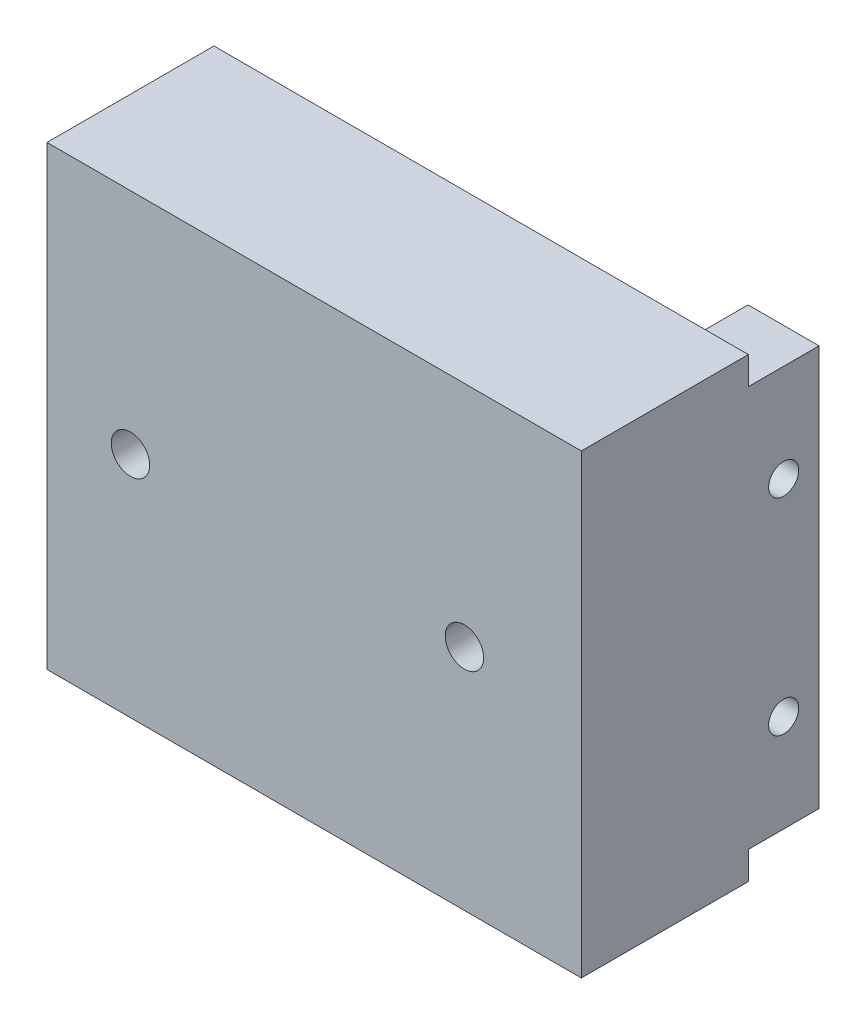
ISO-10303-21;
HEADER;
FILE_DESCRIPTION(('STEP AP214'),'2;1');
FILE_NAME('part.step','',(''),(''),'','','');
FILE_SCHEMA(('AUTOMOTIVE_DESIGN { 1 0 10303 214 1 1 1 1 }'));
ENDSEC;
DATA;
#1=APPLICATION_CONTEXT('core data for automotive mechanical design processes');
#2=APPLICATION_PROTOCOL_DEFINITION('international standard','automotive_design',2000,#1);
#3=PRODUCT_CONTEXT('',#1,'mechanical');
#4=PRODUCT('Part','Part','',(#3));
#5=PRODUCT_RELATED_PRODUCT_CATEGORY('part','',(#4));
#6=PRODUCT_DEFINITION_FORMATION('','',#4);
#7=PRODUCT_DEFINITION_CONTEXT('part definition',#1,'design');
#8=PRODUCT_DEFINITION('design','',#6,#7);
#9=PRODUCT_DEFINITION_SHAPE('','',#8);
#10=(LENGTH_UNIT() NAMED_UNIT(*) SI_UNIT(.MILLI.,.METRE.));
#11=(NAMED_UNIT(*) PLANE_ANGLE_UNIT() SI_UNIT($,.RADIAN.));
#12=(NAMED_UNIT(*) SI_UNIT($,.STERADIAN.) SOLID_ANGLE_UNIT());
#13=UNCERTAINTY_MEASURE_WITH_UNIT(LENGTH_MEASURE(1.E-05),#10,'distance_accuracy_value','');
#14=(GEOMETRIC_REPRESENTATION_CONTEXT(3) GLOBAL_UNCERTAINTY_ASSIGNED_CONTEXT((#13)) GLOBAL_UNIT_ASSIGNED_CONTEXT((#10,
#11,#12)) REPRESENTATION_CONTEXT('',''));
#15=CARTESIAN_POINT('',(0.,0.,0.));
#16=DIRECTION('',(0.,0.,1.));
#17=DIRECTION('',(1.,0.,0.));
#18=AXIS2_PLACEMENT_3D('',#15,#16,#17);
#19=CARTESIAN_POINT('',(-22.5,-20.5,15.));
#20=DIRECTION('',(0.,1.,0.));
#21=DIRECTION('',(0.,0.,1.));
#22=AXIS2_PLACEMENT_3D('',#19,#20,#21);
#23=PLANE('',#22);
#24=DIRECTION('',(1.,0.,0.));
#25=VECTOR('',#24,1.);
#26=CARTESIAN_POINT('',(-22.5,-20.5,0.));
#27=LINE('',#26,#25);
#28=CARTESIAN_POINT('',(-22.5,-20.5,0.));
#29=VERTEX_POINT('',#28);
#30=CARTESIAN_POINT('',(25.5,-20.5,0.));
#31=VERTEX_POINT('',#30);
#32=EDGE_CURVE('E158',#29,#31,#27,.T.);
#33=ORIENTED_EDGE('',*,*,#32,.T.);
#34=DIRECTION('',(0.,0.,-1.));
#35=VECTOR('',#34,1.);
#36=CARTESIAN_POINT('',(25.5,-20.5,15.));
#37=LINE('',#36,#35);
#38=CARTESIAN_POINT('',(25.5,-20.5,15.));
#39=VERTEX_POINT('',#38);
#40=EDGE_CURVE('E11',#39,#31,#37,.T.);
#41=ORIENTED_EDGE('',*,*,#40,.F.);
#42=DIRECTION('',(1.,0.,0.));
#43=VECTOR('',#42,1.);
#44=CARTESIAN_POINT('',(-22.5,-20.5,15.));
#45=LINE('',#44,#43);
#46=CARTESIAN_POINT('',(-22.5,-20.5,15.));
#47=VERTEX_POINT('',#46);
#48=EDGE_CURVE('E162',#47,#39,#45,.T.);
#49=ORIENTED_EDGE('',*,*,#48,.F.);
#50=DIRECTION('',(0.,0.,-1.));
#51=VECTOR('',#50,1.);
#52=CARTESIAN_POINT('',(-22.5,-20.5,15.));
#53=LINE('',#52,#51);
#54=EDGE_CURVE('E63',#47,#29,#53,.T.);
#55=ORIENTED_EDGE('',*,*,#54,.T.);
#56=EDGE_LOOP('',(#33,#41,#49,#55));
#57=FACE_BOUND('',#56,.T.);
#58=ADVANCED_FACE('F38',(#57),#23,.F.);
#59=CARTESIAN_POINT('',(25.5,-20.5,15.));
#60=DIRECTION('',(-1.,0.,0.));
#61=DIRECTION('',(0.,0.,1.));
#62=AXIS2_PLACEMENT_3D('',#59,#60,#61);
#63=PLANE('',#62);
#64=CARTESIAN_POINT('',(25.5,9.25,-3.175));
#65=DIRECTION('',(1.,0.,0.));
#66=DIRECTION('',(0.,0.,-1.));
#67=AXIS2_PLACEMENT_3D('',#64,#65,#66);
#68=CIRCLE('',#67,1.35255);
#69=CARTESIAN_POINT('',(25.5,9.25,-4.52755));
#70=VERTEX_POINT('',#69);
#71=EDGE_CURVE('E244',#70,#70,#68,.T.);
#72=ORIENTED_EDGE('',*,*,#71,.F.);
#73=EDGE_LOOP('',(#72));
#74=FACE_BOUND('',#73,.T.);
#75=CARTESIAN_POINT('',(25.5,-9.25000000000002,-3.175));
#76=DIRECTION('',(1.,0.,0.));
#77=DIRECTION('',(0.,0.,-1.));
#78=AXIS2_PLACEMENT_3D('',#75,#76,#77);
#79=CIRCLE('',#78,1.35255);
#80=CARTESIAN_POINT('',(25.5,-9.25000000000002,-4.52755));
#81=VERTEX_POINT('',#80);
#82=EDGE_CURVE('E247',#81,#81,#79,.T.);
#83=ORIENTED_EDGE('',*,*,#82,.F.);
#84=EDGE_LOOP('',(#83));
#85=FACE_BOUND('',#84,.T.);
#86=DIRECTION('',(0.,1.,0.));
#87=VECTOR('',#86,1.);
#88=CARTESIAN_POINT('',(25.5,-20.5,0.));
#89=LINE('',#88,#87);
#90=CARTESIAN_POINT('',(25.5,-18.,0.));
#91=VERTEX_POINT('',#90);
#92=EDGE_CURVE('E180',#31,#91,#89,.T.);
#93=ORIENTED_EDGE('',*,*,#92,.T.);
#94=DIRECTION('',(0.,0.,1.));
#95=VECTOR('',#94,1.);
#96=CARTESIAN_POINT('',(25.5,-18.,-6.35));
#97=LINE('',#96,#95);
#98=CARTESIAN_POINT('',(25.5,-18.,-6.35));
#99=VERTEX_POINT('',#98);
#100=EDGE_CURVE('E150',#99,#91,#97,.T.);
#101=ORIENTED_EDGE('',*,*,#100,.F.);
#102=DIRECTION('',(0.,1.,0.));
#103=VECTOR('',#102,1.);
#104=CARTESIAN_POINT('',(25.5,-49.2425924217017,-6.35));
#105=LINE('',#104,#103);
#106=CARTESIAN_POINT('',(25.5,18.,-6.35));
#107=VERTEX_POINT('',#106);
#108=EDGE_CURVE('E142',#99,#107,#105,.T.);
#109=ORIENTED_EDGE('',*,*,#108,.T.);
#110=DIRECTION('',(0.,0.,1.));
#111=VECTOR('',#110,1.);
#112=CARTESIAN_POINT('',(25.5,18.,-6.35));
#113=LINE('',#112,#111);
#114=CARTESIAN_POINT('',(25.5,18.,0.));
#115=VERTEX_POINT('',#114);
#116=EDGE_CURVE('E161',#107,#115,#113,.T.);
#117=ORIENTED_EDGE('',*,*,#116,.T.);
#118=CARTESIAN_POINT('',(25.5,20.5,0.));
#119=VERTEX_POINT('',#118);
#120=EDGE_CURVE('E171',#115,#119,#89,.T.);
#121=ORIENTED_EDGE('',*,*,#120,.T.);
#122=DIRECTION('',(0.,0.,-1.));
#123=VECTOR('',#122,1.);
#124=CARTESIAN_POINT('',(25.5,20.5,15.));
#125=LINE('',#124,#123);
#126=CARTESIAN_POINT('',(25.5,20.5,15.));
#127=VERTEX_POINT('',#126);
#128=EDGE_CURVE('E47',#127,#119,#125,.T.);
#129=ORIENTED_EDGE('',*,*,#128,.F.);
#130=DIRECTION('',(0.,1.,0.));
#131=VECTOR('',#130,1.);
#132=CARTESIAN_POINT('',(25.5,-20.5,15.));
#133=LINE('',#132,#131);
#134=EDGE_CURVE('E89',#39,#127,#133,.T.);
#135=ORIENTED_EDGE('',*,*,#134,.F.);
#136=ORIENTED_EDGE('',*,*,#40,.T.);
#137=EDGE_LOOP('',(#93,#101,#109,#117,#121,#129,#135,#136));
#138=FACE_BOUND('',#137,.T.);
#139=ADVANCED_FACE('F199',(#74,#85,#138),#63,.F.);
#140=CARTESIAN_POINT('',(25.5,20.5,15.));
#141=DIRECTION('',(0.,-1.,0.));
#142=DIRECTION('',(1.,0.,0.));
#143=AXIS2_PLACEMENT_3D('',#140,#141,#142);
#144=PLANE('',#143);
#145=DIRECTION('',(-1.,0.,0.));
#146=VECTOR('',#145,1.);
#147=CARTESIAN_POINT('',(25.5,20.5,0.));
#148=LINE('',#147,#146);
#149=CARTESIAN_POINT('',(-22.5,20.5,0.));
#150=VERTEX_POINT('',#149);
#151=EDGE_CURVE('E174',#119,#150,#148,.T.);
#152=ORIENTED_EDGE('',*,*,#151,.T.);
#153=DIRECTION('',(0.,0.,-1.));
#154=VECTOR('',#153,1.);
#155=CARTESIAN_POINT('',(-22.5,20.5,15.));
#156=LINE('',#155,#154);
#157=CARTESIAN_POINT('',(-22.5,20.5,15.));
#158=VERTEX_POINT('',#157);
#159=EDGE_CURVE('E185',#158,#150,#156,.T.);
#160=ORIENTED_EDGE('',*,*,#159,.F.);
#161=DIRECTION('',(-1.,0.,0.));
#162=VECTOR('',#161,1.);
#163=CARTESIAN_POINT('',(25.5,20.5,15.));
#164=LINE('',#163,#162);
#165=EDGE_CURVE('E166',#127,#158,#164,.T.);
#166=ORIENTED_EDGE('',*,*,#165,.F.);
#167=ORIENTED_EDGE('',*,*,#128,.T.);
#168=EDGE_LOOP('',(#152,#160,#166,#167));
#169=FACE_BOUND('',#168,.T.);
#170=ADVANCED_FACE('F193',(#169),#144,.F.);
#171=CARTESIAN_POINT('',(-22.5,-20.5,15.));
#172=DIRECTION('',(-1.,0.,0.));
#173=DIRECTION('',(0.,-1.,0.));
#174=AXIS2_PLACEMENT_3D('',#171,#172,#173);
#175=PLANE('',#174);
#176=DIRECTION('',(0.,1.,0.));
#177=VECTOR('',#176,1.);
#178=CARTESIAN_POINT('',(-22.5,-20.5,0.));
#179=LINE('',#178,#177);
#180=EDGE_CURVE('E164',#29,#150,#179,.T.);
#181=ORIENTED_EDGE('',*,*,#180,.F.);
#182=ORIENTED_EDGE('',*,*,#54,.F.);
#183=DIRECTION('',(0.,1.,0.));
#184=VECTOR('',#183,1.);
#185=CARTESIAN_POINT('',(-22.5,-20.5,15.));
#186=LINE('',#185,#184);
#187=EDGE_CURVE('E168',#47,#158,#186,.T.);
#188=ORIENTED_EDGE('',*,*,#187,.T.);
#189=ORIENTED_EDGE('',*,*,#159,.T.);
#190=EDGE_LOOP('',(#181,#182,#188,#189));
#191=FACE_BOUND('',#190,.T.);
#192=ADVANCED_FACE('F216',(#191),#175,.T.);
#193=CARTESIAN_POINT('',(25.5,-20.5,15.));
#194=DIRECTION('',(0.,0.,1.));
#195=DIRECTION('',(1.,0.,0.));
#196=AXIS2_PLACEMENT_3D('',#193,#194,#195);
#197=PLANE('',#196);
#198=CARTESIAN_POINT('',(15.,0.,15.));
#199=DIRECTION('',(0.,0.,1.));
#200=DIRECTION('',(1.,0.,0.));
#201=AXIS2_PLACEMENT_3D('',#198,#199,#200);
#202=CIRCLE('',#201,1.72719999999999);
#203=CARTESIAN_POINT('',(16.7272,0.,15.));
#204=VERTEX_POINT('',#203);
#205=EDGE_CURVE('E127',#204,#204,#202,.T.);
#206=ORIENTED_EDGE('',*,*,#205,.F.);
#207=EDGE_LOOP('',(#206));
#208=FACE_BOUND('',#207,.T.);
#209=CARTESIAN_POINT('',(-15.,0.,15.));
#210=DIRECTION('',(0.,0.,1.));
#211=DIRECTION('',(1.,0.,0.));
#212=AXIS2_PLACEMENT_3D('',#209,#210,#211);
#213=CIRCLE('',#212,1.72719999999999);
#214=CARTESIAN_POINT('',(-13.2728,0.,15.));
#215=VERTEX_POINT('',#214);
#216=EDGE_CURVE('E126',#215,#215,#213,.T.);
#217=ORIENTED_EDGE('',*,*,#216,.F.);
#218=EDGE_LOOP('',(#217));
#219=FACE_BOUND('',#218,.T.);
#220=ORIENTED_EDGE('',*,*,#48,.T.);
#221=ORIENTED_EDGE('',*,*,#134,.T.);
#222=ORIENTED_EDGE('',*,*,#165,.T.);
#223=ORIENTED_EDGE('',*,*,#187,.F.);
#224=EDGE_LOOP('',(#220,#221,#222,#223));
#225=FACE_BOUND('',#224,.T.);
#226=ADVANCED_FACE('F219',(#208,#219,#225),#197,.T.);
#227=CARTESIAN_POINT('',(25.5,-20.5,0.));
#228=DIRECTION('',(0.,0.,1.));
#229=DIRECTION('',(1.,0.,0.));
#230=AXIS2_PLACEMENT_3D('',#227,#228,#229);
#231=PLANE('',#230);
#232=DIRECTION('',(0.,-1.,0.));
#233=VECTOR('',#232,1.);
#234=CARTESIAN_POINT('',(19.125,-49.2425924217017,0.));
#235=LINE('',#234,#233);
#236=CARTESIAN_POINT('',(19.125,18.,0.));
#237=VERTEX_POINT('',#236);
#238=CARTESIAN_POINT('',(19.125,-18.,0.));
#239=VERTEX_POINT('',#238);
#240=EDGE_CURVE('E143',#237,#239,#235,.T.);
#241=ORIENTED_EDGE('',*,*,#240,.T.);
#242=DIRECTION('',(1.,0.,0.));
#243=VECTOR('',#242,1.);
#244=CARTESIAN_POINT('',(1.5,-18.,0.));
#245=LINE('',#244,#243);
#246=EDGE_CURVE('E41',#239,#91,#245,.T.);
#247=ORIENTED_EDGE('',*,*,#246,.T.);
#248=ORIENTED_EDGE('',*,*,#92,.F.);
#249=ORIENTED_EDGE('',*,*,#32,.F.);
#250=ORIENTED_EDGE('',*,*,#180,.T.);
#251=ORIENTED_EDGE('',*,*,#151,.F.);
#252=ORIENTED_EDGE('',*,*,#120,.F.);
#253=DIRECTION('',(1.,0.,0.));
#254=VECTOR('',#253,1.);
#255=CARTESIAN_POINT('',(1.5,18.,0.));
#256=LINE('',#255,#254);
#257=EDGE_CURVE('E155',#237,#115,#256,.T.);
#258=ORIENTED_EDGE('',*,*,#257,.F.);
#259=EDGE_LOOP('',(#241,#247,#248,#249,#250,#251,#252,#258));
#260=FACE_BOUND('',#259,.T.);
#261=ADVANCED_FACE('F196',(#260),#231,.F.);
#262=CARTESIAN_POINT('',(1.5,-18.,-6.35));
#263=DIRECTION('',(0.,-1.,0.));
#264=DIRECTION('',(0.,0.,-1.));
#265=AXIS2_PLACEMENT_3D('',#262,#263,#264);
#266=PLANE('',#265);
#267=ORIENTED_EDGE('',*,*,#246,.F.);
#268=DIRECTION('',(0.,0.,1.));
#269=VECTOR('',#268,1.);
#270=CARTESIAN_POINT('',(19.125,-18.,-6.35));
#271=LINE('',#270,#269);
#272=CARTESIAN_POINT('',(19.125,-18.,-6.35));
#273=VERTEX_POINT('',#272);
#274=EDGE_CURVE('E156',#273,#239,#271,.T.);
#275=ORIENTED_EDGE('',*,*,#274,.F.);
#276=DIRECTION('',(1.,0.,0.));
#277=VECTOR('',#276,1.);
#278=CARTESIAN_POINT('',(1.5,-18.,-6.35));
#279=LINE('',#278,#277);
#280=EDGE_CURVE('E139',#273,#99,#279,.T.);
#281=ORIENTED_EDGE('',*,*,#280,.T.);
#282=ORIENTED_EDGE('',*,*,#100,.T.);
#283=EDGE_LOOP('',(#267,#275,#281,#282));
#284=FACE_BOUND('',#283,.T.);
#285=ADVANCED_FACE('F213',(#284),#266,.T.);
#286=CARTESIAN_POINT('',(19.125,-49.2425924217017,-6.35));
#287=DIRECTION('',(-1.,0.,0.));
#288=DIRECTION('',(0.,-1.,0.));
#289=AXIS2_PLACEMENT_3D('',#286,#287,#288);
#290=PLANE('',#289);
#291=CARTESIAN_POINT('',(19.125,9.25,-3.175));
#292=DIRECTION('',(-1.,0.,0.));
#293=DIRECTION('',(0.,-1.,0.));
#294=AXIS2_PLACEMENT_3D('',#291,#292,#293);
#295=CIRCLE('',#294,1.35254999999999);
#296=CARTESIAN_POINT('',(19.125,7.89745000000001,-3.175));
#297=VERTEX_POINT('',#296);
#298=EDGE_CURVE('E249',#297,#297,#295,.T.);
#299=ORIENTED_EDGE('',*,*,#298,.F.);
#300=EDGE_LOOP('',(#299));
#301=FACE_BOUND('',#300,.T.);
#302=CARTESIAN_POINT('',(19.125,-9.25000000000002,-3.175));
#303=DIRECTION('',(-1.,0.,0.));
#304=DIRECTION('',(0.,-1.,0.));
#305=AXIS2_PLACEMENT_3D('',#302,#303,#304);
#306=CIRCLE('',#305,1.35254999999999);
#307=CARTESIAN_POINT('',(19.125,-10.60255,-3.175));
#308=VERTEX_POINT('',#307);
#309=EDGE_CURVE('E133',#308,#308,#306,.T.);
#310=ORIENTED_EDGE('',*,*,#309,.F.);
#311=EDGE_LOOP('',(#310));
#312=FACE_BOUND('',#311,.T.);
#313=ORIENTED_EDGE('',*,*,#240,.F.);
#314=DIRECTION('',(0.,0.,1.));
#315=VECTOR('',#314,1.);
#316=CARTESIAN_POINT('',(19.125,18.,-6.35));
#317=LINE('',#316,#315);
#318=CARTESIAN_POINT('',(19.125,18.,-6.35));
#319=VERTEX_POINT('',#318);
#320=EDGE_CURVE('E159',#319,#237,#317,.T.);
#321=ORIENTED_EDGE('',*,*,#320,.F.);
#322=DIRECTION('',(0.,-1.,0.));
#323=VECTOR('',#322,1.);
#324=CARTESIAN_POINT('',(19.125,-49.2425924217017,-6.35));
#325=LINE('',#324,#323);
#326=EDGE_CURVE('E148',#319,#273,#325,.T.);
#327=ORIENTED_EDGE('',*,*,#326,.T.);
#328=ORIENTED_EDGE('',*,*,#274,.T.);
#329=EDGE_LOOP('',(#313,#321,#327,#328));
#330=FACE_BOUND('',#329,.T.);
#331=ADVANCED_FACE('F280',(#301,#312,#330),#290,.T.);
#332=CARTESIAN_POINT('',(1.5,18.,-6.35));
#333=DIRECTION('',(0.,-1.,0.));
#334=DIRECTION('',(0.,0.,-1.));
#335=AXIS2_PLACEMENT_3D('',#332,#333,#334);
#336=PLANE('',#335);
#337=ORIENTED_EDGE('',*,*,#257,.T.);
#338=ORIENTED_EDGE('',*,*,#116,.F.);
#339=DIRECTION('',(1.,0.,0.));
#340=VECTOR('',#339,1.);
#341=CARTESIAN_POINT('',(1.5,18.,-6.35));
#342=LINE('',#341,#340);
#343=EDGE_CURVE('E146',#319,#107,#342,.T.);
#344=ORIENTED_EDGE('',*,*,#343,.F.);
#345=ORIENTED_EDGE('',*,*,#320,.T.);
#346=EDGE_LOOP('',(#337,#338,#344,#345));
#347=FACE_BOUND('',#346,.T.);
#348=ADVANCED_FACE('F204',(#347),#336,.F.);
#349=CARTESIAN_POINT('',(1.5,-49.2425924217017,-6.35));
#350=DIRECTION('',(0.,0.,1.));
#351=DIRECTION('',(1.,0.,0.));
#352=AXIS2_PLACEMENT_3D('',#349,#350,#351);
#353=PLANE('',#352);
#354=ORIENTED_EDGE('',*,*,#280,.F.);
#355=ORIENTED_EDGE('',*,*,#326,.F.);
#356=ORIENTED_EDGE('',*,*,#343,.T.);
#357=ORIENTED_EDGE('',*,*,#108,.F.);
#358=EDGE_LOOP('',(#354,#355,#356,#357));
#359=FACE_BOUND('',#358,.T.);
#360=ADVANCED_FACE('F275',(#359),#353,.F.);
#361=CARTESIAN_POINT('',(-15.,0.,1.04));
#362=DIRECTION('',(0.,0.,1.));
#363=DIRECTION('',(1.,0.,0.));
#364=AXIS2_PLACEMENT_3D('',#361,#362,#363);
#365=CONICAL_SURFACE('',#364,1.7272,1.02974425867665);
#366=CARTESIAN_POINT('',(-15.,0.,0.00219353881559387));
#367=VERTEX_POINT('',#366);
#368=VERTEX_LOOP('',#367);
#369=FACE_BOUND('',#368,.T.);
#370=CARTESIAN_POINT('',(-15.,0.,1.04));
#371=DIRECTION('',(0.,0.,1.));
#372=DIRECTION('',(1.,0.,0.));
#373=AXIS2_PLACEMENT_3D('',#370,#371,#372);
#374=CIRCLE('',#373,1.7272);
#375=CARTESIAN_POINT('',(-13.2728,0.,1.04));
#376=VERTEX_POINT('',#375);
#377=EDGE_CURVE('E130',#376,#376,#374,.T.);
#378=ORIENTED_EDGE('',*,*,#377,.T.);
#379=EDGE_LOOP('',(#378));
#380=FACE_BOUND('',#379,.T.);
#381=ADVANCED_FACE('F271',(#369,#380),#365,.F.);
#382=CARTESIAN_POINT('',(-15.,0.,15.));
#383=DIRECTION('',(0.,0.,1.));
#384=DIRECTION('',(1.,0.,0.));
#385=AXIS2_PLACEMENT_3D('',#382,#383,#384);
#386=CYLINDRICAL_SURFACE('',#385,1.72719999999999);
#387=ORIENTED_EDGE('',*,*,#377,.F.);
#388=EDGE_LOOP('',(#387));
#389=FACE_BOUND('',#388,.T.);
#390=ORIENTED_EDGE('',*,*,#216,.T.);
#391=EDGE_LOOP('',(#390));
#392=FACE_BOUND('',#391,.T.);
#393=ADVANCED_FACE('F120',(#389,#392),#386,.F.);
#394=CARTESIAN_POINT('',(15.,0.,1.04));
#395=DIRECTION('',(0.,0.,1.));
#396=DIRECTION('',(1.,0.,0.));
#397=AXIS2_PLACEMENT_3D('',#394,#395,#396);
#398=CONICAL_SURFACE('',#397,1.7272,1.02974425867665);
#399=CARTESIAN_POINT('',(15.,0.,0.00219353881559387));
#400=VERTEX_POINT('',#399);
#401=VERTEX_LOOP('',#400);
#402=FACE_BOUND('',#401,.T.);
#403=CARTESIAN_POINT('',(15.,0.,1.04));
#404=DIRECTION('',(0.,0.,1.));
#405=DIRECTION('',(1.,0.,0.));
#406=AXIS2_PLACEMENT_3D('',#403,#404,#405);
#407=CIRCLE('',#406,1.7272);
#408=CARTESIAN_POINT('',(16.7272,0.,1.04));
#409=VERTEX_POINT('',#408);
#410=EDGE_CURVE('E124',#409,#409,#407,.T.);
#411=ORIENTED_EDGE('',*,*,#410,.T.);
#412=EDGE_LOOP('',(#411));
#413=FACE_BOUND('',#412,.T.);
#414=ADVANCED_FACE('F116',(#402,#413),#398,.F.);
#415=CARTESIAN_POINT('',(15.,0.,15.));
#416=DIRECTION('',(0.,0.,1.));
#417=DIRECTION('',(1.,0.,0.));
#418=AXIS2_PLACEMENT_3D('',#415,#416,#417);
#419=CYLINDRICAL_SURFACE('',#418,1.72719999999999);
#420=ORIENTED_EDGE('',*,*,#410,.F.);
#421=EDGE_LOOP('',(#420));
#422=FACE_BOUND('',#421,.T.);
#423=ORIENTED_EDGE('',*,*,#205,.T.);
#424=EDGE_LOOP('',(#423));
#425=FACE_BOUND('',#424,.T.);
#426=ADVANCED_FACE('F119',(#422,#425),#419,.F.);
#427=CARTESIAN_POINT('',(25.5,-9.25000000000002,-3.175));
#428=DIRECTION('',(1.,0.,0.));
#429=DIRECTION('',(0.,0.,-1.));
#430=AXIS2_PLACEMENT_3D('',#427,#428,#429);
#431=CYLINDRICAL_SURFACE('',#430,1.35254999999999);
#432=ORIENTED_EDGE('',*,*,#309,.T.);
#433=EDGE_LOOP('',(#432));
#434=FACE_BOUND('',#433,.T.);
#435=ORIENTED_EDGE('',*,*,#82,.T.);
#436=EDGE_LOOP('',(#435));
#437=FACE_BOUND('',#436,.T.);
#438=ADVANCED_FACE('F258',(#434,#437),#431,.F.);
#439=CARTESIAN_POINT('',(25.5,9.25,-3.175));
#440=DIRECTION('',(1.,0.,0.));
#441=DIRECTION('',(0.,0.,-1.));
#442=AXIS2_PLACEMENT_3D('',#439,#440,#441);
#443=CYLINDRICAL_SURFACE('',#442,1.35254999999999);
#444=ORIENTED_EDGE('',*,*,#298,.T.);
#445=EDGE_LOOP('',(#444));
#446=FACE_BOUND('',#445,.T.);
#447=ORIENTED_EDGE('',*,*,#71,.T.);
#448=EDGE_LOOP('',(#447));
#449=FACE_BOUND('',#448,.T.);
#450=ADVANCED_FACE('F256',(#446,#449),#443,.F.);
#451=CLOSED_SHELL('',(#58,#139,#170,#192,#226,#261,#285,#331,#348,#360,#381,#393,#414,#426,#438,#450));
#452=MANIFOLD_SOLID_BREP('B2',#451);
#453=ADVANCED_BREP_SHAPE_REPRESENTATION('',(#18,#452),#14);
#454=SHAPE_DEFINITION_REPRESENTATION(#9,#453);
ENDSEC;
END-ISO-10303-21;
